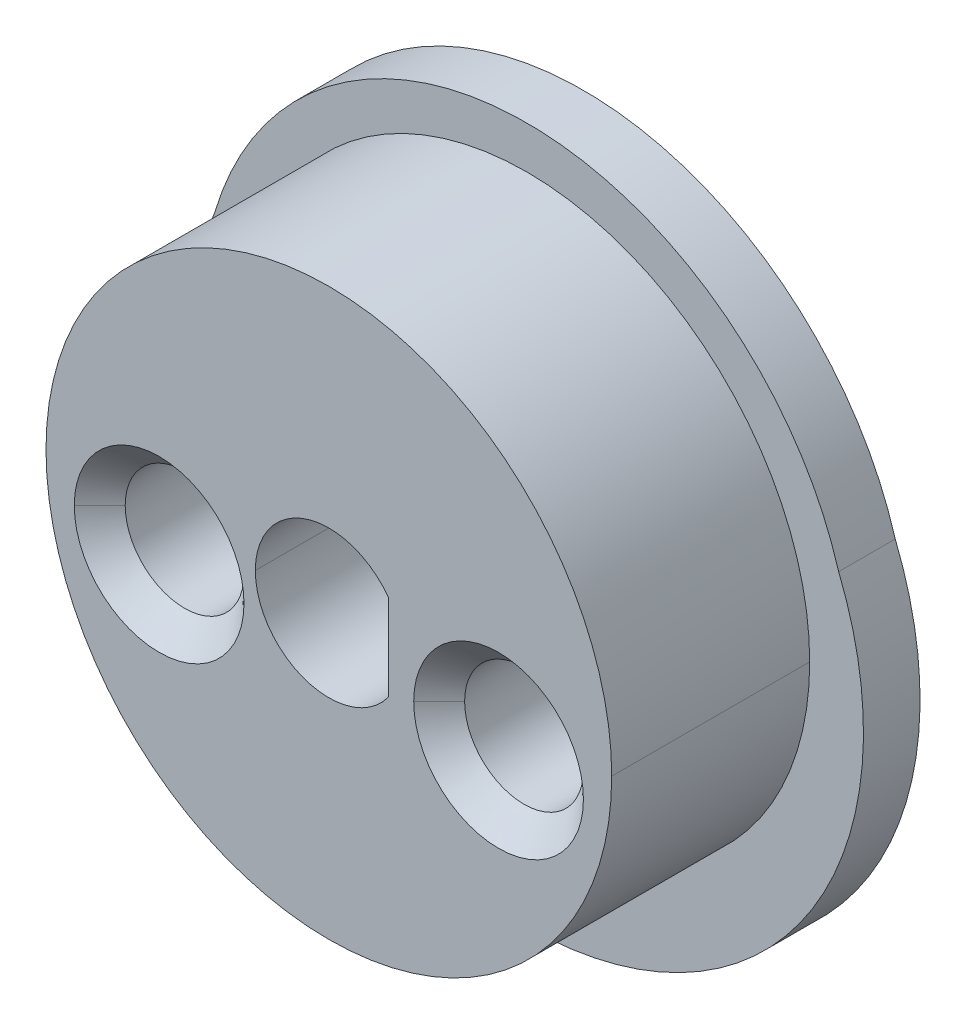
ISO-10303-21;
HEADER;
FILE_DESCRIPTION(('STEP AP214'),'2;1');
FILE_NAME('part.step','',(''),(''),'','','');
FILE_SCHEMA(('AUTOMOTIVE_DESIGN { 1 0 10303 214 1 1 1 1 }'));
ENDSEC;
DATA;
#1=APPLICATION_CONTEXT('core data for automotive mechanical design processes');
#2=APPLICATION_PROTOCOL_DEFINITION('international standard','automotive_design',2000,#1);
#3=PRODUCT_CONTEXT('',#1,'mechanical');
#4=PRODUCT('Part','Part','',(#3));
#5=PRODUCT_RELATED_PRODUCT_CATEGORY('part','',(#4));
#6=PRODUCT_DEFINITION_FORMATION('','',#4);
#7=PRODUCT_DEFINITION_CONTEXT('part definition',#1,'design');
#8=PRODUCT_DEFINITION('design','',#6,#7);
#9=PRODUCT_DEFINITION_SHAPE('','',#8);
#10=(LENGTH_UNIT() NAMED_UNIT(*) SI_UNIT(.MILLI.,.METRE.));
#11=(NAMED_UNIT(*) PLANE_ANGLE_UNIT() SI_UNIT($,.RADIAN.));
#12=(NAMED_UNIT(*) SI_UNIT($,.STERADIAN.) SOLID_ANGLE_UNIT());
#13=UNCERTAINTY_MEASURE_WITH_UNIT(LENGTH_MEASURE(1.E-05),#10,'distance_accuracy_value','');
#14=(GEOMETRIC_REPRESENTATION_CONTEXT(3) GLOBAL_UNCERTAINTY_ASSIGNED_CONTEXT((#13)) GLOBAL_UNIT_ASSIGNED_CONTEXT((#10,
#11,#12)) REPRESENTATION_CONTEXT('',''));
#15=CARTESIAN_POINT('',(0.,0.,0.));
#16=DIRECTION('',(0.,0.,1.));
#17=DIRECTION('',(1.,0.,0.));
#18=AXIS2_PLACEMENT_3D('',#15,#16,#17);
#19=CARTESIAN_POINT('',(-6.,-1.21,17.));
#20=DIRECTION('',(0.,0.,1.));
#21=DIRECTION('',(1.,0.,0.));
#22=AXIS2_PLACEMENT_3D('',#19,#20,#21);
#23=CONICAL_SURFACE('',#22,2.,0.78539816339745);
#24=DIRECTION('',(-0.707106781186549,0.,0.707106781186546));
#25=VECTOR('',#24,1.);
#26=CARTESIAN_POINT('',(-8.,-1.21,17.));
#27=LINE('',#26,#25);
#28=CARTESIAN_POINT('',(-8.1,-1.21,17.1));
#29=VERTEX_POINT('',#28);
#30=CARTESIAN_POINT('',(-9.,-1.21,18.));
#31=VERTEX_POINT('',#30);
#32=EDGE_CURVE('E161',#29,#31,#27,.T.);
#33=ORIENTED_EDGE('',*,*,#32,.F.);
#34=CARTESIAN_POINT('',(-6.,-1.21,17.1));
#35=DIRECTION('',(0.,0.,1.));
#36=DIRECTION('',(1.,0.,0.));
#37=AXIS2_PLACEMENT_3D('',#34,#35,#36);
#38=CIRCLE('',#37,2.1);
#39=CARTESIAN_POINT('',(-3.9,-1.21,17.1));
#40=VERTEX_POINT('',#39);
#41=EDGE_CURVE('E67',#29,#40,#38,.F.);
#42=ORIENTED_EDGE('',*,*,#41,.T.);
#43=DIRECTION('',(0.707106781186549,0.,0.707106781186546));
#44=VECTOR('',#43,1.);
#45=CARTESIAN_POINT('',(-4.,-1.21,17.));
#46=LINE('',#45,#44);
#47=CARTESIAN_POINT('',(-3.,-1.21,18.));
#48=VERTEX_POINT('',#47);
#49=EDGE_CURVE('E159',#40,#48,#46,.T.);
#50=ORIENTED_EDGE('',*,*,#49,.T.);
#51=CARTESIAN_POINT('',(-6.,-1.21,18.));
#52=DIRECTION('',(0.,0.,-1.));
#53=DIRECTION('',(1.,0.,0.));
#54=AXIS2_PLACEMENT_3D('',#51,#52,#53);
#55=CIRCLE('',#54,3.);
#56=EDGE_CURVE('E228',#31,#48,#55,.T.);
#57=ORIENTED_EDGE('',*,*,#56,.F.);
#58=EDGE_LOOP('',(#33,#42,#50,#57));
#59=FACE_BOUND('',#58,.T.);
#60=ADVANCED_FACE('F47',(#59),#23,.F.);
#61=CARTESIAN_POINT('',(6.,-1.21,17.));
#62=DIRECTION('',(0.,0.,1.));
#63=DIRECTION('',(1.,0.,0.));
#64=AXIS2_PLACEMENT_3D('',#61,#62,#63);
#65=CONICAL_SURFACE('',#64,2.,0.785398163397449);
#66=DIRECTION('',(-0.707106781186548,0.,0.707106781186547));
#67=VECTOR('',#66,1.);
#68=CARTESIAN_POINT('',(4.,-1.21,17.));
#69=LINE('',#68,#67);
#70=CARTESIAN_POINT('',(3.9,-1.21,17.1));
#71=VERTEX_POINT('',#70);
#72=CARTESIAN_POINT('',(3.,-1.21,18.));
#73=VERTEX_POINT('',#72);
#74=EDGE_CURVE('E169',#71,#73,#69,.T.);
#75=ORIENTED_EDGE('',*,*,#74,.F.);
#76=CARTESIAN_POINT('',(6.,-1.21,17.1));
#77=DIRECTION('',(0.,0.,1.));
#78=DIRECTION('',(1.,0.,0.));
#79=AXIS2_PLACEMENT_3D('',#76,#77,#78);
#80=CIRCLE('',#79,2.1);
#81=CARTESIAN_POINT('',(8.1,-1.21,17.1));
#82=VERTEX_POINT('',#81);
#83=EDGE_CURVE('E61',#71,#82,#80,.F.);
#84=ORIENTED_EDGE('',*,*,#83,.T.);
#85=DIRECTION('',(0.707106781186548,0.,0.707106781186547));
#86=VECTOR('',#85,1.);
#87=CARTESIAN_POINT('',(8.,-1.21,17.));
#88=LINE('',#87,#86);
#89=CARTESIAN_POINT('',(9.,-1.21,18.));
#90=VERTEX_POINT('',#89);
#91=EDGE_CURVE('E217',#82,#90,#88,.T.);
#92=ORIENTED_EDGE('',*,*,#91,.T.);
#93=CARTESIAN_POINT('',(6.,-1.21,18.));
#94=DIRECTION('',(0.,0.,-1.));
#95=DIRECTION('',(1.,0.,0.));
#96=AXIS2_PLACEMENT_3D('',#93,#94,#95);
#97=CIRCLE('',#96,3.);
#98=EDGE_CURVE('E232',#73,#90,#97,.T.);
#99=ORIENTED_EDGE('',*,*,#98,.F.);
#100=EDGE_LOOP('',(#75,#84,#92,#99));
#101=FACE_BOUND('',#100,.T.);
#102=ADVANCED_FACE('F336',(#101),#65,.F.);
#103=CARTESIAN_POINT('',(2.09999999999983,1.53297097167533,17.9999999999996));
#104=DIRECTION('',(1.,0.,0.));
#105=DIRECTION('',(0.,0.,1.));
#106=AXIS2_PLACEMENT_3D('',#103,#104,#105);
#107=PLANE('',#106);
#108=DIRECTION('',(0.,1.,0.));
#109=VECTOR('',#108,1.);
#110=CARTESIAN_POINT('',(2.09999999999984,0.766485485837665,9.));
#111=LINE('',#110,#109);
#112=CARTESIAN_POINT('',(2.09999999999984,-1.5329709716759,9.));
#113=VERTEX_POINT('',#112);
#114=CARTESIAN_POINT('',(2.09999999999984,1.53297097167533,9.));
#115=VERTEX_POINT('',#114);
#116=EDGE_CURVE('E236',#113,#115,#111,.T.);
#117=ORIENTED_EDGE('',*,*,#116,.F.);
#118=DIRECTION('',(0.,0.,-1.));
#119=VECTOR('',#118,1.);
#120=CARTESIAN_POINT('',(2.09999999999983,-1.5329709716759,17.9999999999996));
#121=LINE('',#120,#119);
#122=CARTESIAN_POINT('',(2.09999999999983,-1.5329709716759,18.));
#123=VERTEX_POINT('',#122);
#124=EDGE_CURVE('E156',#123,#113,#121,.T.);
#125=ORIENTED_EDGE('',*,*,#124,.F.);
#126=DIRECTION('',(0.,-1.,0.));
#127=VECTOR('',#126,1.);
#128=CARTESIAN_POINT('',(2.09999999999983,0.,18.));
#129=LINE('',#128,#127);
#130=CARTESIAN_POINT('',(2.09999999999983,1.53297097167533,18.));
#131=VERTEX_POINT('',#130);
#132=EDGE_CURVE('E181',#131,#123,#129,.T.);
#133=ORIENTED_EDGE('',*,*,#132,.F.);
#134=DIRECTION('',(0.,0.,-1.));
#135=VECTOR('',#134,1.);
#136=CARTESIAN_POINT('',(2.09999999999983,1.53297097167533,17.9999999999996));
#137=LINE('',#136,#135);
#138=EDGE_CURVE('E197',#131,#115,#137,.T.);
#139=ORIENTED_EDGE('',*,*,#138,.T.);
#140=EDGE_LOOP('',(#117,#125,#133,#139));
#141=FACE_BOUND('',#140,.T.);
#142=ADVANCED_FACE('F330',(#141),#107,.F.);
#143=CARTESIAN_POINT('',(-1.59872115546023E-13,-2.8421709430404E-13,17.9999999999996));
#144=DIRECTION('',(0.,0.,-1.));
#145=DIRECTION('',(-1.,0.,0.));
#146=AXIS2_PLACEMENT_3D('',#143,#144,#145);
#147=CYLINDRICAL_SURFACE('',#146,2.6);
#148=DIRECTION('',(0.,0.,-1.));
#149=VECTOR('',#148,1.);
#150=CARTESIAN_POINT('',(-2.60000000000016,-2.83784107324437E-13,17.9999999999996));
#151=LINE('',#150,#149);
#152=CARTESIAN_POINT('',(-2.60000000000016,-2.82410206331463E-13,18.));
#153=VERTEX_POINT('',#152);
#154=CARTESIAN_POINT('',(-2.60000000000015,-2.82410206331463E-13,9.));
#155=VERTEX_POINT('',#154);
#156=EDGE_CURVE('E216',#153,#155,#151,.T.);
#157=ORIENTED_EDGE('',*,*,#156,.F.);
#158=CARTESIAN_POINT('',(-1.59872115546023E-13,-2.8421709430404E-13,18.));
#159=DIRECTION('',(0.,0.,-1.));
#160=DIRECTION('',(-1.,0.,0.));
#161=AXIS2_PLACEMENT_3D('',#158,#159,#160);
#162=CIRCLE('',#161,2.6);
#163=EDGE_CURVE('E231',#123,#153,#162,.T.);
#164=ORIENTED_EDGE('',*,*,#163,.F.);
#165=ORIENTED_EDGE('',*,*,#124,.T.);
#166=CARTESIAN_POINT('',(-1.5487611193521E-13,-2.81469292318093E-13,9.));
#167=DIRECTION('',(0.,0.,1.));
#168=DIRECTION('',(-1.,0.,0.));
#169=AXIS2_PLACEMENT_3D('',#166,#167,#168);
#170=CIRCLE('',#169,2.6);
#171=EDGE_CURVE('E211',#155,#113,#170,.T.);
#172=ORIENTED_EDGE('',*,*,#171,.F.);
#173=EDGE_LOOP('',(#157,#164,#165,#172));
#174=FACE_BOUND('',#173,.T.);
#175=ADVANCED_FACE('F320',(#174),#147,.F.);
#176=CARTESIAN_POINT('',(0.,-1.21,9.));
#177=DIRECTION('',(0.,0.,1.));
#178=DIRECTION('',(0.,-1.,0.));
#179=AXIS2_PLACEMENT_3D('',#176,#177,#178);
#180=CYLINDRICAL_SURFACE('',#179,11.9010989010989);
#181=DIRECTION('',(0.,0.,1.));
#182=VECTOR('',#181,1.);
#183=CARTESIAN_POINT('',(0.,-13.1110989010989,9.));
#184=LINE('',#183,#182);
#185=CARTESIAN_POINT('',(0.,-13.1110989010989,9.));
#186=VERTEX_POINT('',#185);
#187=CARTESIAN_POINT('',(0.,-13.1110989010989,11.));
#188=VERTEX_POINT('',#187);
#189=EDGE_CURVE('E183',#186,#188,#184,.T.);
#190=ORIENTED_EDGE('',*,*,#189,.F.);
#191=CARTESIAN_POINT('',(0.,-1.21,9.));
#192=DIRECTION('',(0.,0.,1.));
#193=DIRECTION('',(-1.,0.,0.));
#194=AXIS2_PLACEMENT_3D('',#191,#192,#193);
#195=CIRCLE('',#194,11.9010989010989);
#196=CARTESIAN_POINT('',(11.0242322682793,3.27357646848657,9.));
#197=VERTEX_POINT('',#196);
#198=EDGE_CURVE('E207',#186,#197,#195,.T.);
#199=ORIENTED_EDGE('',*,*,#198,.T.);
#200=DIRECTION('',(0.,0.,-1.));
#201=VECTOR('',#200,1.);
#202=CARTESIAN_POINT('',(11.0242322682793,3.27357646848657,9.));
#203=LINE('',#202,#201);
#204=CARTESIAN_POINT('',(11.0242322682793,3.27357646848657,11.));
#205=VERTEX_POINT('',#204);
#206=EDGE_CURVE('E189',#205,#197,#203,.T.);
#207=ORIENTED_EDGE('',*,*,#206,.F.);
#208=CARTESIAN_POINT('',(0.,-1.21,11.));
#209=DIRECTION('',(0.,0.,1.));
#210=DIRECTION('',(-1.,0.,0.));
#211=AXIS2_PLACEMENT_3D('',#208,#209,#210);
#212=CIRCLE('',#211,11.9010989010989);
#213=EDGE_CURVE('E191',#188,#205,#212,.T.);
#214=ORIENTED_EDGE('',*,*,#213,.F.);
#215=EDGE_LOOP('',(#190,#199,#207,#214));
#216=FACE_BOUND('',#215,.T.);
#217=ADVANCED_FACE('F318',(#216),#180,.T.);
#218=CARTESIAN_POINT('',(0.,0.,11.));
#219=DIRECTION('',(0.,0.,1.));
#220=DIRECTION('',(1.,0.,0.));
#221=AXIS2_PLACEMENT_3D('',#218,#219,#220);
#222=PLANE('',#221);
#223=CARTESIAN_POINT('',(0.,0.,11.));
#224=DIRECTION('',(0.,0.,-1.));
#225=DIRECTION('',(-1.,0.,0.));
#226=AXIS2_PLACEMENT_3D('',#223,#224,#225);
#227=CIRCLE('',#226,10.);
#228=CARTESIAN_POINT('',(-10.,0.,11.));
#229=VERTEX_POINT('',#228);
#230=CARTESIAN_POINT('',(10.,0.,11.));
#231=VERTEX_POINT('',#230);
#232=EDGE_CURVE('E203',#229,#231,#227,.T.);
#233=ORIENTED_EDGE('',*,*,#232,.T.);
#234=CARTESIAN_POINT('',(0.,0.,11.));
#235=DIRECTION('',(0.,0.,-1.));
#236=DIRECTION('',(-1.,0.,0.));
#237=AXIS2_PLACEMENT_3D('',#234,#235,#236);
#238=CIRCLE('',#237,10.);
#239=EDGE_CURVE('E202',#231,#229,#238,.T.);
#240=ORIENTED_EDGE('',*,*,#239,.T.);
#241=EDGE_LOOP('',(#233,#240));
#242=FACE_BOUND('',#241,.T.);
#243=CARTESIAN_POINT('',(0.,0.,11.));
#244=DIRECTION('',(0.,0.,1.));
#245=DIRECTION('',(-1.,0.,0.));
#246=AXIS2_PLACEMENT_3D('',#243,#244,#245);
#247=CIRCLE('',#246,11.5);
#248=CARTESIAN_POINT('',(-11.0242322682793,3.27357646848657,11.));
#249=VERTEX_POINT('',#248);
#250=EDGE_CURVE('E192',#205,#249,#247,.T.);
#251=ORIENTED_EDGE('',*,*,#250,.T.);
#252=CARTESIAN_POINT('',(0.,-1.21,11.));
#253=DIRECTION('',(0.,0.,1.));
#254=DIRECTION('',(-1.,0.,0.));
#255=AXIS2_PLACEMENT_3D('',#252,#253,#254);
#256=CIRCLE('',#255,11.9010989010989);
#257=EDGE_CURVE('E187',#249,#188,#256,.T.);
#258=ORIENTED_EDGE('',*,*,#257,.T.);
#259=ORIENTED_EDGE('',*,*,#213,.T.);
#260=EDGE_LOOP('',(#251,#258,#259));
#261=FACE_BOUND('',#260,.T.);
#262=ADVANCED_FACE('F316',(#242,#261),#222,.T.);
#263=CARTESIAN_POINT('',(0.,0.,9.));
#264=DIRECTION('',(0.,0.,1.));
#265=DIRECTION('',(-1.,0.,0.));
#266=AXIS2_PLACEMENT_3D('',#263,#264,#265);
#267=CYLINDRICAL_SURFACE('',#266,11.5);
#268=DIRECTION('',(0.,0.,1.));
#269=VECTOR('',#268,1.);
#270=CARTESIAN_POINT('',(-11.0242322682793,3.27357646848657,9.));
#271=LINE('',#270,#269);
#272=CARTESIAN_POINT('',(-11.0242322682793,3.27357646848657,9.));
#273=VERTEX_POINT('',#272);
#274=EDGE_CURVE('E198',#273,#249,#271,.T.);
#275=ORIENTED_EDGE('',*,*,#274,.T.);
#276=ORIENTED_EDGE('',*,*,#250,.F.);
#277=ORIENTED_EDGE('',*,*,#206,.T.);
#278=CARTESIAN_POINT('',(0.,0.,9.));
#279=DIRECTION('',(0.,0.,-1.));
#280=DIRECTION('',(-1.,0.,0.));
#281=AXIS2_PLACEMENT_3D('',#278,#279,#280);
#282=CIRCLE('',#281,11.5);
#283=EDGE_CURVE('E205',#273,#197,#282,.T.);
#284=ORIENTED_EDGE('',*,*,#283,.F.);
#285=EDGE_LOOP('',(#275,#276,#277,#284));
#286=FACE_BOUND('',#285,.T.);
#287=ADVANCED_FACE('F300',(#286),#267,.T.);
#288=CARTESIAN_POINT('',(0.,0.,9.));
#289=DIRECTION('',(0.,0.,1.));
#290=DIRECTION('',(1.,0.,0.));
#291=AXIS2_PLACEMENT_3D('',#288,#289,#290);
#292=PLANE('',#291);
#293=CARTESIAN_POINT('',(-6.,-1.21,9.));
#294=DIRECTION('',(0.,0.,1.));
#295=DIRECTION('',(1.,0.,0.));
#296=AXIS2_PLACEMENT_3D('',#293,#294,#295);
#297=CIRCLE('',#296,2.1);
#298=CARTESIAN_POINT('',(-3.9,-1.21,9.));
#299=VERTEX_POINT('',#298);
#300=EDGE_CURVE('E162',#299,#299,#297,.F.);
#301=ORIENTED_EDGE('',*,*,#300,.F.);
#302=EDGE_LOOP('',(#301));
#303=FACE_BOUND('',#302,.T.);
#304=CARTESIAN_POINT('',(6.,-1.21,9.));
#305=DIRECTION('',(0.,0.,1.));
#306=DIRECTION('',(1.,0.,0.));
#307=AXIS2_PLACEMENT_3D('',#304,#305,#306);
#308=CIRCLE('',#307,2.1);
#309=CARTESIAN_POINT('',(8.1,-1.21,9.));
#310=VERTEX_POINT('',#309);
#311=EDGE_CURVE('E289',#310,#310,#308,.F.);
#312=ORIENTED_EDGE('',*,*,#311,.F.);
#313=EDGE_LOOP('',(#312));
#314=FACE_BOUND('',#313,.T.);
#315=CARTESIAN_POINT('',(-1.5487611193521E-13,-2.81469292318093E-13,9.));
#316=DIRECTION('',(0.,0.,1.));
#317=DIRECTION('',(-1.,0.,0.));
#318=AXIS2_PLACEMENT_3D('',#315,#316,#317);
#319=CIRCLE('',#318,2.6);
#320=EDGE_CURVE('E221',#115,#155,#319,.T.);
#321=ORIENTED_EDGE('',*,*,#320,.T.);
#322=ORIENTED_EDGE('',*,*,#171,.T.);
#323=ORIENTED_EDGE('',*,*,#116,.T.);
#324=EDGE_LOOP('',(#321,#322,#323));
#325=FACE_BOUND('',#324,.T.);
#326=ORIENTED_EDGE('',*,*,#283,.T.);
#327=ORIENTED_EDGE('',*,*,#198,.F.);
#328=CARTESIAN_POINT('',(0.,-1.21,9.));
#329=DIRECTION('',(0.,0.,1.));
#330=DIRECTION('',(-1.,0.,0.));
#331=AXIS2_PLACEMENT_3D('',#328,#329,#330);
#332=CIRCLE('',#331,11.9010989010989);
#333=EDGE_CURVE('E188',#273,#186,#332,.T.);
#334=ORIENTED_EDGE('',*,*,#333,.F.);
#335=EDGE_LOOP('',(#326,#327,#334));
#336=FACE_BOUND('',#335,.T.);
#337=ADVANCED_FACE('F296',(#303,#314,#325,#336),#292,.F.);
#338=CARTESIAN_POINT('',(0.,0.,11.));
#339=DIRECTION('',(0.,0.,1.));
#340=DIRECTION('',(-1.,0.,0.));
#341=AXIS2_PLACEMENT_3D('',#338,#339,#340);
#342=CYLINDRICAL_SURFACE('',#341,10.);
#343=DIRECTION('',(0.,0.,1.));
#344=VECTOR('',#343,1.);
#345=CARTESIAN_POINT('',(10.,0.,11.));
#346=LINE('',#345,#344);
#347=CARTESIAN_POINT('',(10.,0.,18.));
#348=VERTEX_POINT('',#347);
#349=EDGE_CURVE('E244',#231,#348,#346,.T.);
#350=ORIENTED_EDGE('',*,*,#349,.F.);
#351=ORIENTED_EDGE('',*,*,#232,.F.);
#352=DIRECTION('',(0.,0.,1.));
#353=VECTOR('',#352,1.);
#354=CARTESIAN_POINT('',(-10.,0.,11.));
#355=LINE('',#354,#353);
#356=CARTESIAN_POINT('',(-10.,0.,18.));
#357=VERTEX_POINT('',#356);
#358=EDGE_CURVE('E222',#229,#357,#355,.T.);
#359=ORIENTED_EDGE('',*,*,#358,.T.);
#360=CARTESIAN_POINT('',(0.,0.,18.));
#361=DIRECTION('',(0.,0.,1.));
#362=DIRECTION('',(-1.,0.,0.));
#363=AXIS2_PLACEMENT_3D('',#360,#361,#362);
#364=CIRCLE('',#363,10.);
#365=EDGE_CURVE('E226',#348,#357,#364,.T.);
#366=ORIENTED_EDGE('',*,*,#365,.F.);
#367=EDGE_LOOP('',(#350,#351,#359,#366));
#368=FACE_BOUND('',#367,.T.);
#369=ADVANCED_FACE('F299',(#368),#342,.T.);
#370=CARTESIAN_POINT('',(0.,0.,18.));
#371=DIRECTION('',(0.,0.,1.));
#372=DIRECTION('',(1.,0.,0.));
#373=AXIS2_PLACEMENT_3D('',#370,#371,#372);
#374=PLANE('',#373);
#375=ORIENTED_EDGE('',*,*,#163,.T.);
#376=CARTESIAN_POINT('',(-1.59872115546023E-13,-2.8421709430404E-13,18.));
#377=DIRECTION('',(0.,0.,-1.));
#378=DIRECTION('',(-1.,0.,0.));
#379=AXIS2_PLACEMENT_3D('',#376,#377,#378);
#380=CIRCLE('',#379,2.6);
#381=EDGE_CURVE('E212',#153,#131,#380,.T.);
#382=ORIENTED_EDGE('',*,*,#381,.T.);
#383=ORIENTED_EDGE('',*,*,#132,.T.);
#384=EDGE_LOOP('',(#375,#382,#383));
#385=FACE_BOUND('',#384,.T.);
#386=CARTESIAN_POINT('',(-6.,-1.21,18.));
#387=DIRECTION('',(0.,0.,-1.));
#388=DIRECTION('',(1.,0.,0.));
#389=AXIS2_PLACEMENT_3D('',#386,#387,#388);
#390=CIRCLE('',#389,3.);
#391=EDGE_CURVE('E167',#48,#31,#390,.T.);
#392=ORIENTED_EDGE('',*,*,#391,.T.);
#393=ORIENTED_EDGE('',*,*,#56,.T.);
#394=EDGE_LOOP('',(#392,#393));
#395=FACE_BOUND('',#394,.T.);
#396=CARTESIAN_POINT('',(6.,-1.21,18.));
#397=DIRECTION('',(0.,0.,-1.));
#398=DIRECTION('',(1.,0.,0.));
#399=AXIS2_PLACEMENT_3D('',#396,#397,#398);
#400=CIRCLE('',#399,3.);
#401=EDGE_CURVE('E175',#90,#73,#400,.T.);
#402=ORIENTED_EDGE('',*,*,#401,.T.);
#403=ORIENTED_EDGE('',*,*,#98,.T.);
#404=EDGE_LOOP('',(#402,#403));
#405=FACE_BOUND('',#404,.T.);
#406=CARTESIAN_POINT('',(0.,0.,18.));
#407=DIRECTION('',(0.,0.,1.));
#408=DIRECTION('',(-1.,0.,0.));
#409=AXIS2_PLACEMENT_3D('',#406,#407,#408);
#410=CIRCLE('',#409,10.);
#411=EDGE_CURVE('E227',#357,#348,#410,.T.);
#412=ORIENTED_EDGE('',*,*,#411,.T.);
#413=ORIENTED_EDGE('',*,*,#365,.T.);
#414=EDGE_LOOP('',(#412,#413));
#415=FACE_BOUND('',#414,.T.);
#416=ADVANCED_FACE('F358',(#385,#395,#405,#415),#374,.T.);
#417=CARTESIAN_POINT('',(0.,0.,11.));
#418=DIRECTION('',(0.,0.,1.));
#419=DIRECTION('',(-1.,0.,0.));
#420=AXIS2_PLACEMENT_3D('',#417,#418,#419);
#421=CYLINDRICAL_SURFACE('',#420,10.);
#422=ORIENTED_EDGE('',*,*,#239,.F.);
#423=ORIENTED_EDGE('',*,*,#349,.T.);
#424=ORIENTED_EDGE('',*,*,#411,.F.);
#425=ORIENTED_EDGE('',*,*,#358,.F.);
#426=EDGE_LOOP('',(#422,#423,#424,#425));
#427=FACE_BOUND('',#426,.T.);
#428=ADVANCED_FACE('F49',(#427),#421,.T.);
#429=CARTESIAN_POINT('',(0.,-1.21,9.));
#430=DIRECTION('',(0.,0.,1.));
#431=DIRECTION('',(0.,-1.,0.));
#432=AXIS2_PLACEMENT_3D('',#429,#430,#431);
#433=CYLINDRICAL_SURFACE('',#432,11.9010989010989);
#434=ORIENTED_EDGE('',*,*,#333,.T.);
#435=ORIENTED_EDGE('',*,*,#189,.T.);
#436=ORIENTED_EDGE('',*,*,#257,.F.);
#437=ORIENTED_EDGE('',*,*,#274,.F.);
#438=EDGE_LOOP('',(#434,#435,#436,#437));
#439=FACE_BOUND('',#438,.T.);
#440=ADVANCED_FACE('F314',(#439),#433,.T.);
#441=CARTESIAN_POINT('',(-1.59872115546023E-13,-2.8421709430404E-13,17.9999999999996));
#442=DIRECTION('',(0.,0.,-1.));
#443=DIRECTION('',(-1.,0.,0.));
#444=AXIS2_PLACEMENT_3D('',#441,#442,#443);
#445=CYLINDRICAL_SURFACE('',#444,2.6);
#446=ORIENTED_EDGE('',*,*,#381,.F.);
#447=ORIENTED_EDGE('',*,*,#156,.T.);
#448=ORIENTED_EDGE('',*,*,#320,.F.);
#449=ORIENTED_EDGE('',*,*,#138,.F.);
#450=EDGE_LOOP('',(#446,#447,#448,#449));
#451=FACE_BOUND('',#450,.T.);
#452=ADVANCED_FACE('F349',(#451),#445,.F.);
#453=CARTESIAN_POINT('',(6.,-1.21,17.));
#454=DIRECTION('',(0.,0.,1.));
#455=DIRECTION('',(1.,0.,0.));
#456=AXIS2_PLACEMENT_3D('',#453,#454,#455);
#457=CONICAL_SURFACE('',#456,2.,0.785398163397449);
#458=ORIENTED_EDGE('',*,*,#91,.F.);
#459=CARTESIAN_POINT('',(6.,-1.21,17.1));
#460=DIRECTION('',(0.,0.,1.));
#461=DIRECTION('',(1.,0.,0.));
#462=AXIS2_PLACEMENT_3D('',#459,#460,#461);
#463=CIRCLE('',#462,2.1);
#464=EDGE_CURVE('E11',#82,#71,#463,.F.);
#465=ORIENTED_EDGE('',*,*,#464,.T.);
#466=ORIENTED_EDGE('',*,*,#74,.T.);
#467=ORIENTED_EDGE('',*,*,#401,.F.);
#468=EDGE_LOOP('',(#458,#465,#466,#467));
#469=FACE_BOUND('',#468,.T.);
#470=ADVANCED_FACE('F347',(#469),#457,.F.);
#471=CARTESIAN_POINT('',(-6.,-1.21,17.));
#472=DIRECTION('',(0.,0.,1.));
#473=DIRECTION('',(1.,0.,0.));
#474=AXIS2_PLACEMENT_3D('',#471,#472,#473);
#475=CONICAL_SURFACE('',#474,2.,0.78539816339745);
#476=ORIENTED_EDGE('',*,*,#49,.F.);
#477=CARTESIAN_POINT('',(-6.,-1.21,17.1));
#478=DIRECTION('',(0.,0.,1.));
#479=DIRECTION('',(1.,0.,0.));
#480=AXIS2_PLACEMENT_3D('',#477,#478,#479);
#481=CIRCLE('',#480,2.1);
#482=EDGE_CURVE('E55',#40,#29,#481,.F.);
#483=ORIENTED_EDGE('',*,*,#482,.T.);
#484=ORIENTED_EDGE('',*,*,#32,.T.);
#485=ORIENTED_EDGE('',*,*,#391,.F.);
#486=EDGE_LOOP('',(#476,#483,#484,#485));
#487=FACE_BOUND('',#486,.T.);
#488=ADVANCED_FACE('F165',(#487),#475,.F.);
#489=CARTESIAN_POINT('',(-6.,-1.21,3.060303038033));
#490=DIRECTION('',(0.,0.,1.));
#491=DIRECTION('',(1.,0.,0.));
#492=AXIS2_PLACEMENT_3D('',#489,#490,#491);
#493=CYLINDRICAL_SURFACE('',#492,2.1);
#494=ORIENTED_EDGE('',*,*,#300,.T.);
#495=EDGE_LOOP('',(#494));
#496=FACE_BOUND('',#495,.T.);
#497=ORIENTED_EDGE('',*,*,#482,.F.);
#498=ORIENTED_EDGE('',*,*,#41,.F.);
#499=EDGE_LOOP('',(#497,#498));
#500=FACE_BOUND('',#499,.T.);
#501=ADVANCED_FACE('F152',(#496,#500),#493,.F.);
#502=CARTESIAN_POINT('',(6.,-1.21,3.060303038033));
#503=DIRECTION('',(0.,0.,1.));
#504=DIRECTION('',(1.,0.,0.));
#505=AXIS2_PLACEMENT_3D('',#502,#503,#504);
#506=CYLINDRICAL_SURFACE('',#505,2.1);
#507=ORIENTED_EDGE('',*,*,#311,.T.);
#508=EDGE_LOOP('',(#507));
#509=FACE_BOUND('',#508,.T.);
#510=ORIENTED_EDGE('',*,*,#464,.F.);
#511=ORIENTED_EDGE('',*,*,#83,.F.);
#512=EDGE_LOOP('',(#510,#511));
#513=FACE_BOUND('',#512,.T.);
#514=ADVANCED_FACE('F678',(#509,#513),#506,.F.);
#515=CLOSED_SHELL('',(#60,#102,#142,#175,#217,#262,#287,#337,#369,#416,#428,#440,#452,#470,#488,
#501,#514));
#516=MANIFOLD_SOLID_BREP('B2',#515);
#517=ADVANCED_BREP_SHAPE_REPRESENTATION('',(#18,#516),#14);
#518=SHAPE_DEFINITION_REPRESENTATION(#9,#517);
ENDSEC;
END-ISO-10303-21;
